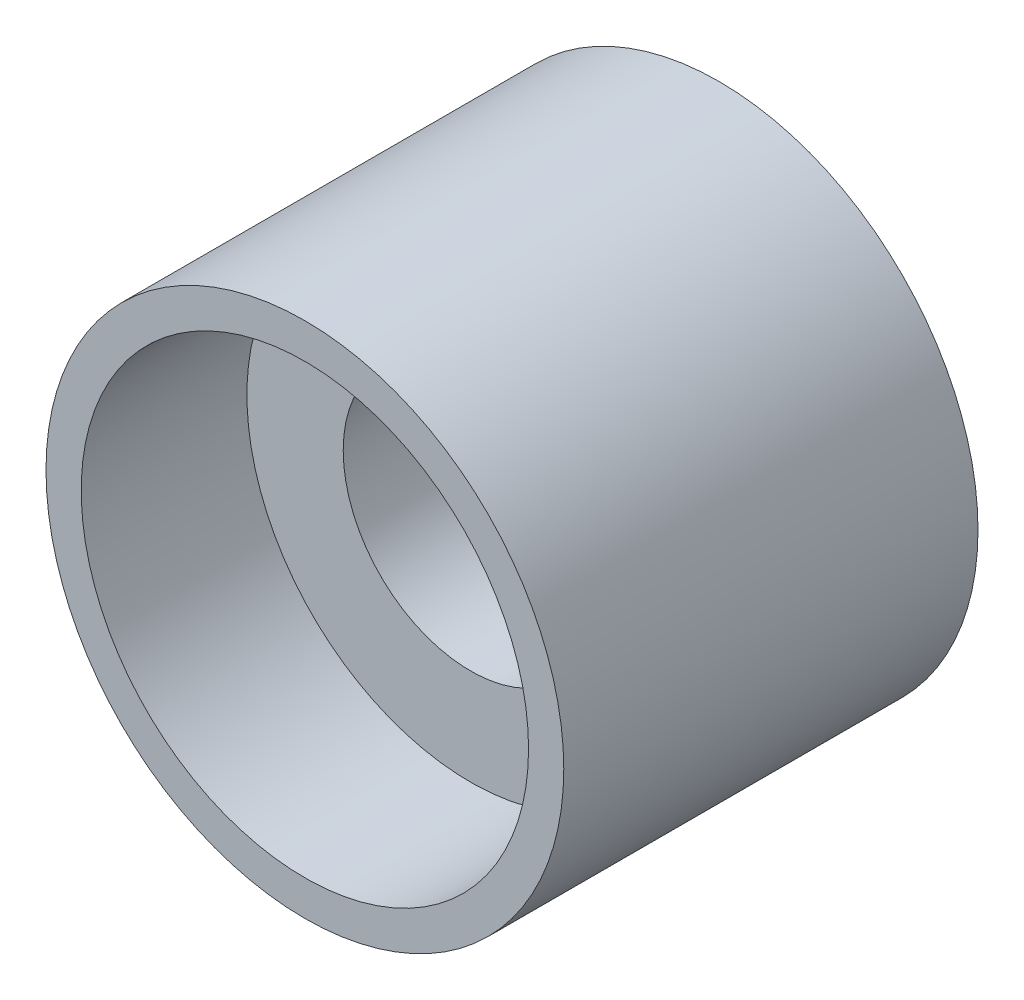
ISO-10303-21;
HEADER;
FILE_DESCRIPTION(('STEP AP214'),'2;1');
FILE_NAME('part.step','',(''),(''),'','','');
FILE_SCHEMA(('AUTOMOTIVE_DESIGN { 1 0 10303 214 1 1 1 1 }'));
ENDSEC;
DATA;
#1=APPLICATION_CONTEXT('core data for automotive mechanical design processes');
#2=APPLICATION_PROTOCOL_DEFINITION('international standard','automotive_design',2000,#1);
#3=PRODUCT_CONTEXT('',#1,'mechanical');
#4=PRODUCT('Part','Part','',(#3));
#5=PRODUCT_RELATED_PRODUCT_CATEGORY('part','',(#4));
#6=PRODUCT_DEFINITION_FORMATION('','',#4);
#7=PRODUCT_DEFINITION_CONTEXT('part definition',#1,'design');
#8=PRODUCT_DEFINITION('design','',#6,#7);
#9=PRODUCT_DEFINITION_SHAPE('','',#8);
#10=(LENGTH_UNIT() NAMED_UNIT(*) SI_UNIT(.MILLI.,.METRE.));
#11=(NAMED_UNIT(*) PLANE_ANGLE_UNIT() SI_UNIT($,.RADIAN.));
#12=(NAMED_UNIT(*) SI_UNIT($,.STERADIAN.) SOLID_ANGLE_UNIT());
#13=UNCERTAINTY_MEASURE_WITH_UNIT(LENGTH_MEASURE(1.E-05),#10,'distance_accuracy_value','');
#14=(GEOMETRIC_REPRESENTATION_CONTEXT(3) GLOBAL_UNCERTAINTY_ASSIGNED_CONTEXT((#13)) GLOBAL_UNIT_ASSIGNED_CONTEXT((#10,
#11,#12)) REPRESENTATION_CONTEXT('',''));
#15=CARTESIAN_POINT('',(0.,0.,0.));
#16=DIRECTION('',(0.,0.,1.));
#17=DIRECTION('',(1.,0.,0.));
#18=AXIS2_PLACEMENT_3D('',#15,#16,#17);
#19=CARTESIAN_POINT('',(0.,0.,20.));
#20=DIRECTION('',(0.,0.,-1.));
#21=DIRECTION('',(-1.,0.,0.));
#22=AXIS2_PLACEMENT_3D('',#19,#20,#21);
#23=CYLINDRICAL_SURFACE('',#22,6.15);
#24=CARTESIAN_POINT('',(0.,0.,0.));
#25=DIRECTION('',(0.,0.,1.));
#26=DIRECTION('',(1.,0.,0.));
#27=AXIS2_PLACEMENT_3D('',#24,#25,#26);
#28=CIRCLE('',#27,6.15);
#29=CARTESIAN_POINT('',(6.15,0.,0.));
#30=VERTEX_POINT('',#29);
#31=EDGE_CURVE('E44',#30,#30,#28,.T.);
#32=ORIENTED_EDGE('',*,*,#31,.F.);
#33=EDGE_LOOP('',(#32));
#34=FACE_BOUND('',#33,.T.);
#35=CARTESIAN_POINT('',(0.,0.,12.));
#36=DIRECTION('',(0.,0.,1.));
#37=DIRECTION('',(1.,0.,0.));
#38=AXIS2_PLACEMENT_3D('',#35,#36,#37);
#39=CIRCLE('',#38,6.15);
#40=CARTESIAN_POINT('',(6.15,0.,12.));
#41=VERTEX_POINT('',#40);
#42=EDGE_CURVE('E35',#41,#41,#39,.T.);
#43=ORIENTED_EDGE('',*,*,#42,.T.);
#44=EDGE_LOOP('',(#43));
#45=FACE_BOUND('',#44,.T.);
#46=ADVANCED_FACE('F31',(#34,#45),#23,.F.);
#47=CARTESIAN_POINT('',(0.,0.,20.));
#48=DIRECTION('',(0.,0.,1.));
#49=DIRECTION('',(1.,0.,0.));
#50=AXIS2_PLACEMENT_3D('',#47,#48,#49);
#51=PLANE('',#50);
#52=CARTESIAN_POINT('',(0.,0.,20.));
#53=DIRECTION('',(0.,0.,1.));
#54=DIRECTION('',(1.,0.,0.));
#55=AXIS2_PLACEMENT_3D('',#52,#53,#54);
#56=CIRCLE('',#55,10.8);
#57=CARTESIAN_POINT('',(10.8,0.,20.));
#58=VERTEX_POINT('',#57);
#59=EDGE_CURVE('E48',#58,#58,#56,.T.);
#60=ORIENTED_EDGE('',*,*,#59,.F.);
#61=EDGE_LOOP('',(#60));
#62=FACE_BOUND('',#61,.T.);
#63=CARTESIAN_POINT('',(0.,0.,20.));
#64=DIRECTION('',(0.,0.,1.));
#65=DIRECTION('',(1.,0.,0.));
#66=AXIS2_PLACEMENT_3D('',#63,#64,#65);
#67=CIRCLE('',#66,12.5);
#68=CARTESIAN_POINT('',(12.5,0.,20.));
#69=VERTEX_POINT('',#68);
#70=EDGE_CURVE('E10',#69,#69,#67,.T.);
#71=ORIENTED_EDGE('',*,*,#70,.T.);
#72=EDGE_LOOP('',(#71));
#73=FACE_BOUND('',#72,.T.);
#74=ADVANCED_FACE('F69',(#62,#73),#51,.T.);
#75=CARTESIAN_POINT('',(0.,0.,0.));
#76=DIRECTION('',(0.,0.,1.));
#77=DIRECTION('',(1.,0.,0.));
#78=AXIS2_PLACEMENT_3D('',#75,#76,#77);
#79=PLANE('',#78);
#80=CARTESIAN_POINT('',(0.,0.,0.));
#81=DIRECTION('',(0.,0.,1.));
#82=DIRECTION('',(1.,0.,0.));
#83=AXIS2_PLACEMENT_3D('',#80,#81,#82);
#84=CIRCLE('',#83,12.5);
#85=CARTESIAN_POINT('',(12.5,0.,0.));
#86=VERTEX_POINT('',#85);
#87=EDGE_CURVE('E39',#86,#86,#84,.T.);
#88=ORIENTED_EDGE('',*,*,#87,.F.);
#89=EDGE_LOOP('',(#88));
#90=FACE_BOUND('',#89,.T.);
#91=ORIENTED_EDGE('',*,*,#31,.T.);
#92=EDGE_LOOP('',(#91));
#93=FACE_BOUND('',#92,.T.);
#94=ADVANCED_FACE('F75',(#90,#93),#79,.F.);
#95=CARTESIAN_POINT('',(0.,0.,20.));
#96=DIRECTION('',(0.,0.,-1.));
#97=DIRECTION('',(-1.,0.,0.));
#98=AXIS2_PLACEMENT_3D('',#95,#96,#97);
#99=CYLINDRICAL_SURFACE('',#98,12.5);
#100=ORIENTED_EDGE('',*,*,#70,.F.);
#101=EDGE_LOOP('',(#100));
#102=FACE_BOUND('',#101,.T.);
#103=ORIENTED_EDGE('',*,*,#87,.T.);
#104=EDGE_LOOP('',(#103));
#105=FACE_BOUND('',#104,.T.);
#106=ADVANCED_FACE('F33',(#102,#105),#99,.T.);
#107=CARTESIAN_POINT('',(0.,0.,12.));
#108=DIRECTION('',(0.,0.,1.));
#109=DIRECTION('',(1.,0.,0.));
#110=AXIS2_PLACEMENT_3D('',#107,#108,#109);
#111=CYLINDRICAL_SURFACE('',#110,10.8);
#112=CARTESIAN_POINT('',(0.,0.,12.));
#113=DIRECTION('',(0.,0.,1.));
#114=DIRECTION('',(1.,0.,0.));
#115=AXIS2_PLACEMENT_3D('',#112,#113,#114);
#116=CIRCLE('',#115,10.8);
#117=CARTESIAN_POINT('',(10.8,0.,12.));
#118=VERTEX_POINT('',#117);
#119=EDGE_CURVE('E51',#118,#118,#116,.T.);
#120=ORIENTED_EDGE('',*,*,#119,.F.);
#121=EDGE_LOOP('',(#120));
#122=FACE_BOUND('',#121,.T.);
#123=ORIENTED_EDGE('',*,*,#59,.T.);
#124=EDGE_LOOP('',(#123));
#125=FACE_BOUND('',#124,.T.);
#126=ADVANCED_FACE('F61',(#122,#125),#111,.F.);
#127=CARTESIAN_POINT('',(0.,0.,12.));
#128=DIRECTION('',(0.,0.,1.));
#129=DIRECTION('',(1.,0.,0.));
#130=AXIS2_PLACEMENT_3D('',#127,#128,#129);
#131=PLANE('',#130);
#132=ORIENTED_EDGE('',*,*,#42,.F.);
#133=EDGE_LOOP('',(#132));
#134=FACE_BOUND('',#133,.T.);
#135=ORIENTED_EDGE('',*,*,#119,.T.);
#136=EDGE_LOOP('',(#135));
#137=FACE_BOUND('',#136,.T.);
#138=ADVANCED_FACE('F59',(#134,#137),#131,.T.);
#139=CLOSED_SHELL('',(#46,#74,#94,#106,#126,#138));
#140=MANIFOLD_SOLID_BREP('B2',#139);
#141=ADVANCED_BREP_SHAPE_REPRESENTATION('',(#18,#140),#14);
#142=SHAPE_DEFINITION_REPRESENTATION(#9,#141);
ENDSEC;
END-ISO-10303-21;
